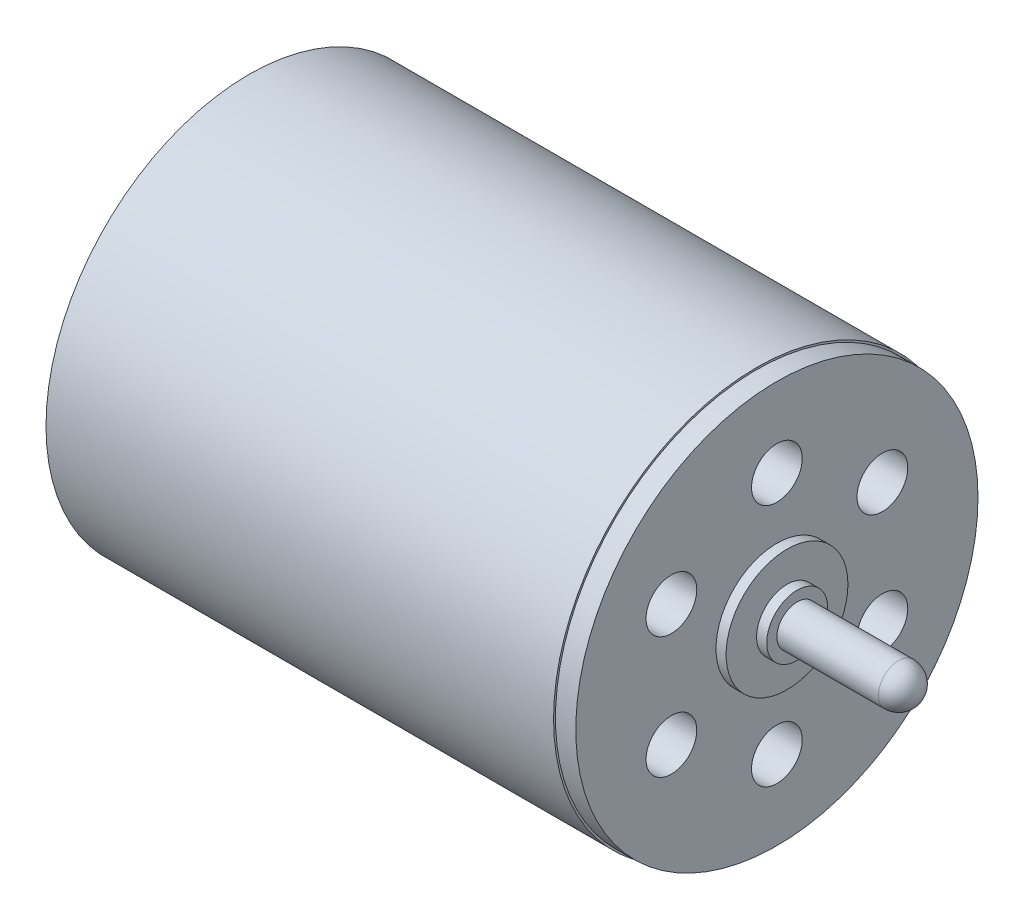
ISO-10303-21;
HEADER;
FILE_DESCRIPTION(('STEP AP214'),'2;1');
FILE_NAME('part.step','',(''),(''),'','','');
FILE_SCHEMA(('AUTOMOTIVE_DESIGN { 1 0 10303 214 1 1 1 1 }'));
ENDSEC;
DATA;
#1=APPLICATION_CONTEXT('core data for automotive mechanical design processes');
#2=APPLICATION_PROTOCOL_DEFINITION('international standard','automotive_design',2000,#1);
#3=PRODUCT_CONTEXT('',#1,'mechanical');
#4=PRODUCT('Part','Part','',(#3));
#5=PRODUCT_RELATED_PRODUCT_CATEGORY('part','',(#4));
#6=PRODUCT_DEFINITION_FORMATION('','',#4);
#7=PRODUCT_DEFINITION_CONTEXT('part definition',#1,'design');
#8=PRODUCT_DEFINITION('design','',#6,#7);
#9=PRODUCT_DEFINITION_SHAPE('','',#8);
#10=(LENGTH_UNIT() NAMED_UNIT(*) SI_UNIT(.MILLI.,.METRE.));
#11=(NAMED_UNIT(*) PLANE_ANGLE_UNIT() SI_UNIT($,.RADIAN.));
#12=(NAMED_UNIT(*) SI_UNIT($,.STERADIAN.) SOLID_ANGLE_UNIT());
#13=UNCERTAINTY_MEASURE_WITH_UNIT(LENGTH_MEASURE(1.E-05),#10,'distance_accuracy_value','');
#14=(GEOMETRIC_REPRESENTATION_CONTEXT(3) GLOBAL_UNCERTAINTY_ASSIGNED_CONTEXT((#13)) GLOBAL_UNIT_ASSIGNED_CONTEXT((#10,
#11,#12)) REPRESENTATION_CONTEXT('',''));
#15=CARTESIAN_POINT('',(0.,0.,0.));
#16=DIRECTION('',(0.,0.,1.));
#17=DIRECTION('',(1.,0.,0.));
#18=AXIS2_PLACEMENT_3D('',#15,#16,#17);
#19=CARTESIAN_POINT('',(26.5,0.,0.));
#20=DIRECTION('',(-1.,0.,0.));
#21=DIRECTION('',(0.,0.,1.));
#22=AXIS2_PLACEMENT_3D('',#19,#20,#21);
#23=CYLINDRICAL_SURFACE('',#22,3.);
#24=CARTESIAN_POINT('',(26.,0.,0.));
#25=DIRECTION('',(1.,0.,0.));
#26=DIRECTION('',(0.,0.,-1.));
#27=AXIS2_PLACEMENT_3D('',#24,#25,#26);
#28=CIRCLE('',#27,3.);
#29=CARTESIAN_POINT('',(26.,0.,-3.));
#30=VERTEX_POINT('',#29);
#31=EDGE_CURVE('E35',#30,#30,#28,.T.);
#32=ORIENTED_EDGE('',*,*,#31,.T.);
#33=EDGE_LOOP('',(#32));
#34=FACE_BOUND('',#33,.T.);
#35=CARTESIAN_POINT('',(26.5,0.,0.));
#36=DIRECTION('',(1.,0.,0.));
#37=DIRECTION('',(0.,0.,-1.));
#38=AXIS2_PLACEMENT_3D('',#35,#36,#37);
#39=CIRCLE('',#38,3.);
#40=CARTESIAN_POINT('',(26.5,0.,-3.));
#41=VERTEX_POINT('',#40);
#42=EDGE_CURVE('E50',#41,#41,#39,.T.);
#43=ORIENTED_EDGE('',*,*,#42,.F.);
#44=EDGE_LOOP('',(#43));
#45=FACE_BOUND('',#44,.T.);
#46=ADVANCED_FACE('F31',(#34,#45),#23,.T.);
#47=CARTESIAN_POINT('',(26.5,0.,0.));
#48=DIRECTION('',(1.,0.,0.));
#49=DIRECTION('',(0.,0.,-1.));
#50=AXIS2_PLACEMENT_3D('',#47,#48,#49);
#51=PLANE('',#50);
#52=CARTESIAN_POINT('',(26.5,0.,0.));
#53=DIRECTION('',(1.,0.,0.));
#54=DIRECTION('',(0.,0.,-1.));
#55=AXIS2_PLACEMENT_3D('',#52,#53,#54);
#56=CIRCLE('',#55,1.5);
#57=CARTESIAN_POINT('',(26.5,0.,-1.5));
#58=VERTEX_POINT('',#57);
#59=EDGE_CURVE('E43',#58,#58,#56,.T.);
#60=ORIENTED_EDGE('',*,*,#59,.F.);
#61=EDGE_LOOP('',(#60));
#62=FACE_BOUND('',#61,.T.);
#63=ORIENTED_EDGE('',*,*,#42,.T.);
#64=EDGE_LOOP('',(#63));
#65=FACE_BOUND('',#64,.T.);
#66=ADVANCED_FACE('F148',(#62,#65),#51,.T.);
#67=CARTESIAN_POINT('',(27.,0.,0.));
#68=DIRECTION('',(-1.,0.,0.));
#69=DIRECTION('',(0.,0.,1.));
#70=AXIS2_PLACEMENT_3D('',#67,#68,#69);
#71=CYLINDRICAL_SURFACE('',#70,1.5);
#72=CARTESIAN_POINT('',(27.,0.,0.));
#73=DIRECTION('',(1.,0.,0.));
#74=DIRECTION('',(0.,0.,-1.));
#75=AXIS2_PLACEMENT_3D('',#72,#73,#74);
#76=CIRCLE('',#75,1.5);
#77=CARTESIAN_POINT('',(27.,0.,-1.5));
#78=VERTEX_POINT('',#77);
#79=EDGE_CURVE('E55',#78,#78,#76,.T.);
#80=ORIENTED_EDGE('',*,*,#79,.F.);
#81=EDGE_LOOP('',(#80));
#82=FACE_BOUND('',#81,.T.);
#83=ORIENTED_EDGE('',*,*,#59,.T.);
#84=EDGE_LOOP('',(#83));
#85=FACE_BOUND('',#84,.T.);
#86=ADVANCED_FACE('F154',(#82,#85),#71,.T.);
#87=CARTESIAN_POINT('',(27.,0.,0.));
#88=DIRECTION('',(1.,0.,0.));
#89=DIRECTION('',(0.,0.,-1.));
#90=AXIS2_PLACEMENT_3D('',#87,#88,#89);
#91=PLANE('',#90);
#92=CARTESIAN_POINT('',(27.,0.,0.));
#93=DIRECTION('',(1.,0.,0.));
#94=DIRECTION('',(0.,0.,-1.));
#95=AXIS2_PLACEMENT_3D('',#92,#93,#94);
#96=CIRCLE('',#95,1.);
#97=CARTESIAN_POINT('',(27.,0.,-1.));
#98=VERTEX_POINT('',#97);
#99=EDGE_CURVE('E39',#98,#98,#96,.T.);
#100=ORIENTED_EDGE('',*,*,#99,.F.);
#101=EDGE_LOOP('',(#100));
#102=FACE_BOUND('',#101,.T.);
#103=ORIENTED_EDGE('',*,*,#79,.T.);
#104=EDGE_LOOP('',(#103));
#105=FACE_BOUND('',#104,.T.);
#106=ADVANCED_FACE('F161',(#102,#105),#91,.T.);
#107=CARTESIAN_POINT('',(33.,0.,0.));
#108=DIRECTION('',(-1.,0.,0.));
#109=DIRECTION('',(0.,0.,1.));
#110=AXIS2_PLACEMENT_3D('',#107,#108,#109);
#111=CYLINDRICAL_SURFACE('',#110,1.);
#112=CARTESIAN_POINT('',(32.,0.,0.));
#113=DIRECTION('',(-1.,0.,0.));
#114=DIRECTION('',(0.,0.,1.));
#115=AXIS2_PLACEMENT_3D('',#112,#113,#114);
#116=CIRCLE('',#115,1.);
#117=CARTESIAN_POINT('',(32.,0.,1.));
#118=VERTEX_POINT('',#117);
#119=EDGE_CURVE('E10',#118,#118,#116,.T.);
#120=ORIENTED_EDGE('',*,*,#119,.T.);
#121=EDGE_LOOP('',(#120));
#122=FACE_BOUND('',#121,.T.);
#123=ORIENTED_EDGE('',*,*,#99,.T.);
#124=EDGE_LOOP('',(#123));
#125=FACE_BOUND('',#124,.T.);
#126=ADVANCED_FACE('F165',(#122,#125),#111,.T.);
#127=CARTESIAN_POINT('',(32.,0.,0.));
#128=DIRECTION('',(1.,0.,0.));
#129=DIRECTION('',(0.,0.,-1.));
#130=AXIS2_PLACEMENT_3D('',#127,#128,#129);
#131=SPHERICAL_SURFACE('',#130,1.);
#132=ORIENTED_EDGE('',*,*,#119,.F.);
#133=EDGE_LOOP('',(#132));
#134=FACE_BOUND('',#133,.T.);
#135=ADVANCED_FACE('F33',(#134),#131,.T.);
#136=CARTESIAN_POINT('',(26.,0.,0.));
#137=DIRECTION('',(-1.,0.,0.));
#138=DIRECTION('',(0.,0.,1.));
#139=AXIS2_PLACEMENT_3D('',#136,#137,#138);
#140=CYLINDRICAL_SURFACE('',#139,9.90594675345909);
#141=CARTESIAN_POINT('',(26.,0.,0.));
#142=DIRECTION('',(1.,0.,0.));
#143=DIRECTION('',(0.,0.,-1.));
#144=AXIS2_PLACEMENT_3D('',#141,#142,#143);
#145=CIRCLE('',#144,9.90594675345909);
#146=CARTESIAN_POINT('',(26.,0.,-9.90594675345909));
#147=VERTEX_POINT('',#146);
#148=EDGE_CURVE('E63',#147,#147,#145,.T.);
#149=ORIENTED_EDGE('',*,*,#148,.F.);
#150=EDGE_LOOP('',(#149));
#151=FACE_BOUND('',#150,.T.);
#152=CARTESIAN_POINT('',(25.,0.,0.));
#153=DIRECTION('',(1.,0.,0.));
#154=DIRECTION('',(0.,0.,-1.));
#155=AXIS2_PLACEMENT_3D('',#152,#153,#154);
#156=CIRCLE('',#155,9.90594675345909);
#157=CARTESIAN_POINT('',(25.,0.,-9.90594675345909));
#158=VERTEX_POINT('',#157);
#159=EDGE_CURVE('E60',#158,#158,#156,.T.);
#160=ORIENTED_EDGE('',*,*,#159,.T.);
#161=EDGE_LOOP('',(#160));
#162=FACE_BOUND('',#161,.T.);
#163=ADVANCED_FACE('F116',(#151,#162),#140,.T.);
#164=CARTESIAN_POINT('',(26.,0.,0.));
#165=DIRECTION('',(1.,0.,0.));
#166=DIRECTION('',(0.,0.,-1.));
#167=AXIS2_PLACEMENT_3D('',#164,#165,#166);
#168=PLANE('',#167);
#169=CARTESIAN_POINT('',(26.,-3.0000000000003,5.19615242270612));
#170=DIRECTION('',(1.,0.,0.));
#171=DIRECTION('',(0.,0.,-1.));
#172=AXIS2_PLACEMENT_3D('',#169,#170,#171);
#173=CIRCLE('',#172,1.25000000000063);
#174=CARTESIAN_POINT('',(26.,-3.0000000000003,3.94615242270549));
#175=VERTEX_POINT('',#174);
#176=EDGE_CURVE('E73',#175,#175,#173,.T.);
#177=ORIENTED_EDGE('',*,*,#176,.F.);
#178=EDGE_LOOP('',(#177));
#179=FACE_BOUND('',#178,.T.);
#180=CARTESIAN_POINT('',(26.,-6.,-6.79916662091231E-13));
#181=DIRECTION('',(1.,0.,0.));
#182=DIRECTION('',(0.,0.,-1.));
#183=AXIS2_PLACEMENT_3D('',#180,#181,#182);
#184=CIRCLE('',#183,1.25000000000069);
#185=CARTESIAN_POINT('',(26.,-6.,-1.25000000000137));
#186=VERTEX_POINT('',#185);
#187=EDGE_CURVE('E79',#186,#186,#184,.T.);
#188=ORIENTED_EDGE('',*,*,#187,.F.);
#189=EDGE_LOOP('',(#188));
#190=FACE_BOUND('',#189,.T.);
#191=CARTESIAN_POINT('',(26.,-2.99999999999971,-5.19615242270714));
#192=DIRECTION('',(1.,0.,0.));
#193=DIRECTION('',(0.,0.,-1.));
#194=AXIS2_PLACEMENT_3D('',#191,#192,#193);
#195=CIRCLE('',#194,1.25000000000043);
#196=CARTESIAN_POINT('',(26.,-2.99999999999971,-6.44615242270757));
#197=VERTEX_POINT('',#196);
#198=EDGE_CURVE('E85',#197,#197,#195,.T.);
#199=ORIENTED_EDGE('',*,*,#198,.F.);
#200=EDGE_LOOP('',(#199));
#201=FACE_BOUND('',#200,.T.);
#202=CARTESIAN_POINT('',(26.,3.0000000000003,-5.1961524227068));
#203=DIRECTION('',(1.,0.,0.));
#204=DIRECTION('',(0.,0.,-1.));
#205=AXIS2_PLACEMENT_3D('',#202,#203,#204);
#206=CIRCLE('',#205,1.25000000000009);
#207=CARTESIAN_POINT('',(26.,3.0000000000003,-6.44615242270689));
#208=VERTEX_POINT('',#207);
#209=EDGE_CURVE('E91',#208,#208,#206,.T.);
#210=ORIENTED_EDGE('',*,*,#209,.F.);
#211=EDGE_LOOP('',(#210));
#212=FACE_BOUND('',#211,.T.);
#213=CARTESIAN_POINT('',(26.,6.,0.));
#214=DIRECTION('',(1.,0.,0.));
#215=DIRECTION('',(0.,0.,-1.));
#216=AXIS2_PLACEMENT_3D('',#213,#214,#215);
#217=CIRCLE('',#216,1.25);
#218=CARTESIAN_POINT('',(26.,6.,-1.25));
#219=VERTEX_POINT('',#218);
#220=EDGE_CURVE('E97',#219,#219,#217,.T.);
#221=ORIENTED_EDGE('',*,*,#220,.F.);
#222=EDGE_LOOP('',(#221));
#223=FACE_BOUND('',#222,.T.);
#224=CARTESIAN_POINT('',(26.,2.9999999999997,5.19615242270646));
#225=DIRECTION('',(1.,0.,0.));
#226=DIRECTION('',(0.,0.,-1.));
#227=AXIS2_PLACEMENT_3D('',#224,#225,#226);
#228=CIRCLE('',#227,1.25000000000032);
#229=CARTESIAN_POINT('',(26.,2.9999999999997,3.94615242270614));
#230=VERTEX_POINT('',#229);
#231=EDGE_CURVE('E67',#230,#230,#228,.T.);
#232=ORIENTED_EDGE('',*,*,#231,.F.);
#233=EDGE_LOOP('',(#232));
#234=FACE_BOUND('',#233,.T.);
#235=ORIENTED_EDGE('',*,*,#31,.F.);
#236=EDGE_LOOP('',(#235));
#237=FACE_BOUND('',#236,.T.);
#238=ORIENTED_EDGE('',*,*,#148,.T.);
#239=EDGE_LOOP('',(#238));
#240=FACE_BOUND('',#239,.T.);
#241=ADVANCED_FACE('F112',(#179,#190,#201,#212,#223,#234,#237,#240),#168,.T.);
#242=CARTESIAN_POINT('',(0.,0.,0.));
#243=DIRECTION('',(1.,0.,0.));
#244=DIRECTION('',(0.,0.,-1.));
#245=AXIS2_PLACEMENT_3D('',#242,#243,#244);
#246=PLANE('',#245);
#247=CARTESIAN_POINT('',(0.,0.,0.));
#248=DIRECTION('',(1.,0.,0.));
#249=DIRECTION('',(0.,0.,-1.));
#250=AXIS2_PLACEMENT_3D('',#247,#248,#249);
#251=CIRCLE('',#250,10.);
#252=CARTESIAN_POINT('',(0.,0.,-10.));
#253=VERTEX_POINT('',#252);
#254=EDGE_CURVE('E46',#253,#253,#251,.T.);
#255=ORIENTED_EDGE('',*,*,#254,.F.);
#256=EDGE_LOOP('',(#255));
#257=FACE_BOUND('',#256,.T.);
#258=ADVANCED_FACE('F115',(#257),#246,.F.);
#259=CARTESIAN_POINT('',(25.,0.,0.));
#260=DIRECTION('',(-1.,0.,0.));
#261=DIRECTION('',(0.,0.,1.));
#262=AXIS2_PLACEMENT_3D('',#259,#260,#261);
#263=CYLINDRICAL_SURFACE('',#262,10.);
#264=CARTESIAN_POINT('',(25.,0.,0.));
#265=DIRECTION('',(1.,0.,0.));
#266=DIRECTION('',(0.,0.,-1.));
#267=AXIS2_PLACEMENT_3D('',#264,#265,#266);
#268=CIRCLE('',#267,10.);
#269=CARTESIAN_POINT('',(25.,0.,-10.));
#270=VERTEX_POINT('',#269);
#271=EDGE_CURVE('E49',#270,#270,#268,.T.);
#272=ORIENTED_EDGE('',*,*,#271,.F.);
#273=EDGE_LOOP('',(#272));
#274=FACE_BOUND('',#273,.T.);
#275=ORIENTED_EDGE('',*,*,#254,.T.);
#276=EDGE_LOOP('',(#275));
#277=FACE_BOUND('',#276,.T.);
#278=ADVANCED_FACE('F135',(#274,#277),#263,.T.);
#279=CARTESIAN_POINT('',(25.,0.,0.));
#280=DIRECTION('',(1.,0.,0.));
#281=DIRECTION('',(0.,0.,-1.));
#282=AXIS2_PLACEMENT_3D('',#279,#280,#281);
#283=PLANE('',#282);
#284=ORIENTED_EDGE('',*,*,#159,.F.);
#285=EDGE_LOOP('',(#284));
#286=FACE_BOUND('',#285,.T.);
#287=ORIENTED_EDGE('',*,*,#271,.T.);
#288=EDGE_LOOP('',(#287));
#289=FACE_BOUND('',#288,.T.);
#290=ADVANCED_FACE('F131',(#286,#289),#283,.T.);
#291=CARTESIAN_POINT('',(20.,2.9999999999997,5.19615242270646));
#292=DIRECTION('',(1.,0.,0.));
#293=DIRECTION('',(0.,0.,-1.));
#294=AXIS2_PLACEMENT_3D('',#291,#292,#293);
#295=CYLINDRICAL_SURFACE('',#294,1.25000000000032);
#296=CARTESIAN_POINT('',(20.,2.9999999999997,5.19615242270646));
#297=DIRECTION('',(1.,0.,0.));
#298=DIRECTION('',(0.,0.,-1.));
#299=AXIS2_PLACEMENT_3D('',#296,#297,#298);
#300=CIRCLE('',#299,1.25000000000032);
#301=CARTESIAN_POINT('',(20.,2.9999999999997,3.94615242270614));
#302=VERTEX_POINT('',#301);
#303=EDGE_CURVE('E64',#302,#302,#300,.T.);
#304=ORIENTED_EDGE('',*,*,#303,.F.);
#305=EDGE_LOOP('',(#304));
#306=FACE_BOUND('',#305,.T.);
#307=ORIENTED_EDGE('',*,*,#231,.T.);
#308=EDGE_LOOP('',(#307));
#309=FACE_BOUND('',#308,.T.);
#310=ADVANCED_FACE('F134',(#306,#309),#295,.F.);
#311=CARTESIAN_POINT('',(20.,2.9999999999997,5.19615242270646));
#312=DIRECTION('',(1.,0.,0.));
#313=DIRECTION('',(0.,0.,-1.));
#314=AXIS2_PLACEMENT_3D('',#311,#312,#313);
#315=PLANE('',#314);
#316=ORIENTED_EDGE('',*,*,#303,.T.);
#317=EDGE_LOOP('',(#316));
#318=FACE_BOUND('',#317,.T.);
#319=ADVANCED_FACE('F108',(#318),#315,.T.);
#320=CARTESIAN_POINT('',(20.,6.,0.));
#321=DIRECTION('',(1.,0.,0.));
#322=DIRECTION('',(0.,0.,-1.));
#323=AXIS2_PLACEMENT_3D('',#320,#321,#322);
#324=CYLINDRICAL_SURFACE('',#323,1.25);
#325=CARTESIAN_POINT('',(20.,6.,0.));
#326=DIRECTION('',(1.,0.,0.));
#327=DIRECTION('',(0.,0.,-1.));
#328=AXIS2_PLACEMENT_3D('',#325,#326,#327);
#329=CIRCLE('',#328,1.25);
#330=CARTESIAN_POINT('',(20.,6.,-1.25));
#331=VERTEX_POINT('',#330);
#332=EDGE_CURVE('E70',#331,#331,#329,.T.);
#333=ORIENTED_EDGE('',*,*,#332,.F.);
#334=EDGE_LOOP('',(#333));
#335=FACE_BOUND('',#334,.T.);
#336=ORIENTED_EDGE('',*,*,#220,.T.);
#337=EDGE_LOOP('',(#336));
#338=FACE_BOUND('',#337,.T.);
#339=ADVANCED_FACE('F105',(#335,#338),#324,.F.);
#340=CARTESIAN_POINT('',(20.,6.,0.));
#341=DIRECTION('',(1.,0.,0.));
#342=DIRECTION('',(0.,0.,-1.));
#343=AXIS2_PLACEMENT_3D('',#340,#341,#342);
#344=PLANE('',#343);
#345=ORIENTED_EDGE('',*,*,#332,.T.);
#346=EDGE_LOOP('',(#345));
#347=FACE_BOUND('',#346,.T.);
#348=ADVANCED_FACE('F103',(#347),#344,.T.);
#349=CARTESIAN_POINT('',(20.,3.0000000000003,-5.1961524227068));
#350=DIRECTION('',(1.,0.,0.));
#351=DIRECTION('',(0.,0.,-1.));
#352=AXIS2_PLACEMENT_3D('',#349,#350,#351);
#353=CYLINDRICAL_SURFACE('',#352,1.25000000000009);
#354=CARTESIAN_POINT('',(20.,3.0000000000003,-5.1961524227068));
#355=DIRECTION('',(1.,0.,0.));
#356=DIRECTION('',(0.,0.,-1.));
#357=AXIS2_PLACEMENT_3D('',#354,#355,#356);
#358=CIRCLE('',#357,1.25000000000009);
#359=CARTESIAN_POINT('',(20.,3.0000000000003,-6.44615242270689));
#360=VERTEX_POINT('',#359);
#361=EDGE_CURVE('E94',#360,#360,#358,.T.);
#362=ORIENTED_EDGE('',*,*,#361,.F.);
#363=EDGE_LOOP('',(#362));
#364=FACE_BOUND('',#363,.T.);
#365=ORIENTED_EDGE('',*,*,#209,.T.);
#366=EDGE_LOOP('',(#365));
#367=FACE_BOUND('',#366,.T.);
#368=ADVANCED_FACE('F200',(#364,#367),#353,.F.);
#369=CARTESIAN_POINT('',(20.,3.0000000000003,-5.1961524227068));
#370=DIRECTION('',(1.,0.,0.));
#371=DIRECTION('',(0.,0.,-1.));
#372=AXIS2_PLACEMENT_3D('',#369,#370,#371);
#373=PLANE('',#372);
#374=ORIENTED_EDGE('',*,*,#361,.T.);
#375=EDGE_LOOP('',(#374));
#376=FACE_BOUND('',#375,.T.);
#377=ADVANCED_FACE('F195',(#376),#373,.T.);
#378=CARTESIAN_POINT('',(20.,-2.99999999999971,-5.19615242270714));
#379=DIRECTION('',(1.,0.,0.));
#380=DIRECTION('',(0.,0.,-1.));
#381=AXIS2_PLACEMENT_3D('',#378,#379,#380);
#382=CYLINDRICAL_SURFACE('',#381,1.25000000000043);
#383=CARTESIAN_POINT('',(20.,-2.99999999999971,-5.19615242270714));
#384=DIRECTION('',(1.,0.,0.));
#385=DIRECTION('',(0.,0.,-1.));
#386=AXIS2_PLACEMENT_3D('',#383,#384,#385);
#387=CIRCLE('',#386,1.25000000000043);
#388=CARTESIAN_POINT('',(20.,-2.99999999999971,-6.44615242270757));
#389=VERTEX_POINT('',#388);
#390=EDGE_CURVE('E88',#389,#389,#387,.T.);
#391=ORIENTED_EDGE('',*,*,#390,.F.);
#392=EDGE_LOOP('',(#391));
#393=FACE_BOUND('',#392,.T.);
#394=ORIENTED_EDGE('',*,*,#198,.T.);
#395=EDGE_LOOP('',(#394));
#396=FACE_BOUND('',#395,.T.);
#397=ADVANCED_FACE('F192',(#393,#396),#382,.F.);
#398=CARTESIAN_POINT('',(20.,-2.99999999999971,-5.19615242270714));
#399=DIRECTION('',(1.,0.,0.));
#400=DIRECTION('',(0.,0.,-1.));
#401=AXIS2_PLACEMENT_3D('',#398,#399,#400);
#402=PLANE('',#401);
#403=ORIENTED_EDGE('',*,*,#390,.T.);
#404=EDGE_LOOP('',(#403));
#405=FACE_BOUND('',#404,.T.);
#406=ADVANCED_FACE('F187',(#405),#402,.T.);
#407=CARTESIAN_POINT('',(20.,-6.,-6.79916662091231E-13));
#408=DIRECTION('',(1.,0.,0.));
#409=DIRECTION('',(0.,0.,-1.));
#410=AXIS2_PLACEMENT_3D('',#407,#408,#409);
#411=CYLINDRICAL_SURFACE('',#410,1.25000000000069);
#412=CARTESIAN_POINT('',(20.,-6.,-6.79916662091231E-13));
#413=DIRECTION('',(1.,0.,0.));
#414=DIRECTION('',(0.,0.,-1.));
#415=AXIS2_PLACEMENT_3D('',#412,#413,#414);
#416=CIRCLE('',#415,1.25000000000069);
#417=CARTESIAN_POINT('',(20.,-6.,-1.25000000000137));
#418=VERTEX_POINT('',#417);
#419=EDGE_CURVE('E82',#418,#418,#416,.T.);
#420=ORIENTED_EDGE('',*,*,#419,.F.);
#421=EDGE_LOOP('',(#420));
#422=FACE_BOUND('',#421,.T.);
#423=ORIENTED_EDGE('',*,*,#187,.T.);
#424=EDGE_LOOP('',(#423));
#425=FACE_BOUND('',#424,.T.);
#426=ADVANCED_FACE('F184',(#422,#425),#411,.F.);
#427=CARTESIAN_POINT('',(20.,-6.,-6.79916662091231E-13));
#428=DIRECTION('',(1.,0.,0.));
#429=DIRECTION('',(0.,0.,-1.));
#430=AXIS2_PLACEMENT_3D('',#427,#428,#429);
#431=PLANE('',#430);
#432=ORIENTED_EDGE('',*,*,#419,.T.);
#433=EDGE_LOOP('',(#432));
#434=FACE_BOUND('',#433,.T.);
#435=ADVANCED_FACE('F179',(#434),#431,.T.);
#436=CARTESIAN_POINT('',(20.,-3.0000000000003,5.19615242270612));
#437=DIRECTION('',(1.,0.,0.));
#438=DIRECTION('',(0.,0.,-1.));
#439=AXIS2_PLACEMENT_3D('',#436,#437,#438);
#440=CYLINDRICAL_SURFACE('',#439,1.25000000000063);
#441=CARTESIAN_POINT('',(20.,-3.0000000000003,5.19615242270612));
#442=DIRECTION('',(1.,0.,0.));
#443=DIRECTION('',(0.,0.,-1.));
#444=AXIS2_PLACEMENT_3D('',#441,#442,#443);
#445=CIRCLE('',#444,1.25000000000063);
#446=CARTESIAN_POINT('',(20.,-3.0000000000003,3.94615242270549));
#447=VERTEX_POINT('',#446);
#448=EDGE_CURVE('E76',#447,#447,#445,.T.);
#449=ORIENTED_EDGE('',*,*,#448,.F.);
#450=EDGE_LOOP('',(#449));
#451=FACE_BOUND('',#450,.T.);
#452=ORIENTED_EDGE('',*,*,#176,.T.);
#453=EDGE_LOOP('',(#452));
#454=FACE_BOUND('',#453,.T.);
#455=ADVANCED_FACE('F175',(#451,#454),#440,.F.);
#456=CARTESIAN_POINT('',(20.,-3.0000000000003,5.19615242270612));
#457=DIRECTION('',(1.,0.,0.));
#458=DIRECTION('',(0.,0.,-1.));
#459=AXIS2_PLACEMENT_3D('',#456,#457,#458);
#460=PLANE('',#459);
#461=ORIENTED_EDGE('',*,*,#448,.T.);
#462=EDGE_LOOP('',(#461));
#463=FACE_BOUND('',#462,.T.);
#464=ADVANCED_FACE('F178',(#463),#460,.T.);
#465=CLOSED_SHELL('',(#46,#66,#86,#106,#126,#135,#163,#241,#258,#278,#290,#310,#319,#339,#348,
#368,#377,#397,#406,#426,#435,#455,#464));
#466=MANIFOLD_SOLID_BREP('B2',#465);
#467=ADVANCED_BREP_SHAPE_REPRESENTATION('',(#18,#466),#14);
#468=SHAPE_DEFINITION_REPRESENTATION(#9,#467);
ENDSEC;
END-ISO-10303-21;
